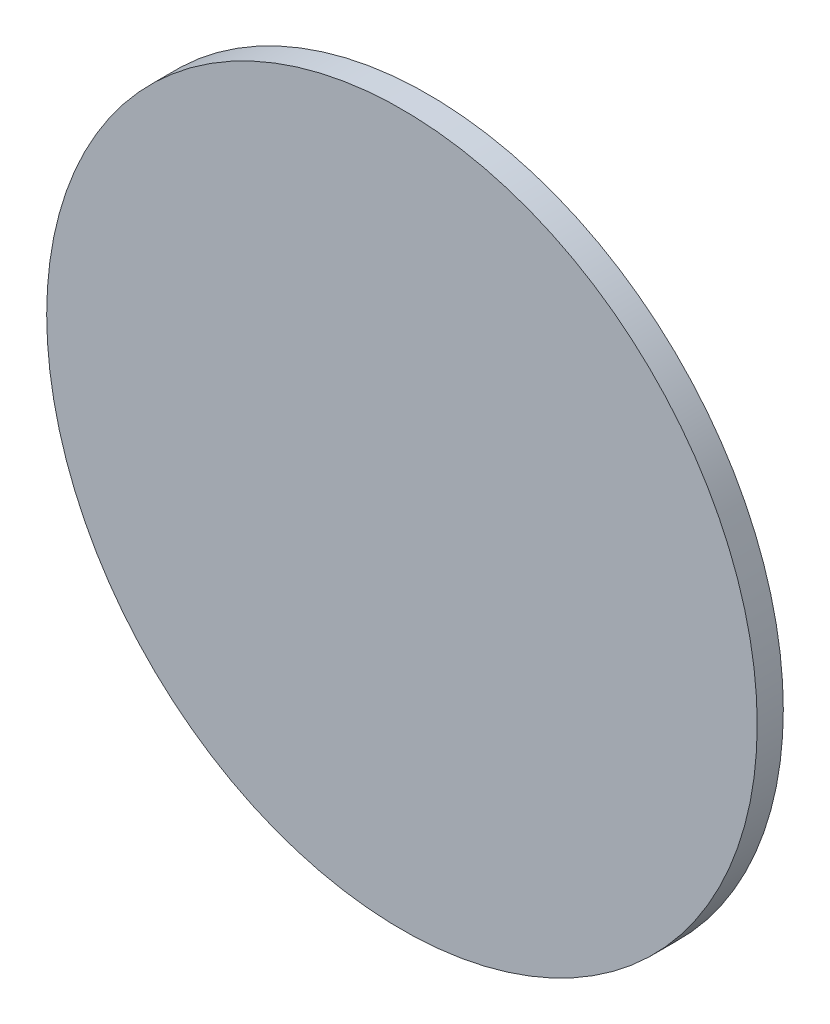
ISO-10303-21;
HEADER;
FILE_DESCRIPTION(('STEP AP214'),'2;1');
FILE_NAME('part.step','',(''),(''),'','','');
FILE_SCHEMA(('AUTOMOTIVE_DESIGN { 1 0 10303 214 1 1 1 1 }'));
ENDSEC;
DATA;
#1=APPLICATION_CONTEXT('core data for automotive mechanical design processes');
#2=APPLICATION_PROTOCOL_DEFINITION('international standard','automotive_design',2000,#1);
#3=PRODUCT_CONTEXT('',#1,'mechanical');
#4=PRODUCT('Part','Part','',(#3));
#5=PRODUCT_RELATED_PRODUCT_CATEGORY('part','',(#4));
#6=PRODUCT_DEFINITION_FORMATION('','',#4);
#7=PRODUCT_DEFINITION_CONTEXT('part definition',#1,'design');
#8=PRODUCT_DEFINITION('design','',#6,#7);
#9=PRODUCT_DEFINITION_SHAPE('','',#8);
#10=(LENGTH_UNIT() NAMED_UNIT(*) SI_UNIT(.MILLI.,.METRE.));
#11=(NAMED_UNIT(*) PLANE_ANGLE_UNIT() SI_UNIT($,.RADIAN.));
#12=(NAMED_UNIT(*) SI_UNIT($,.STERADIAN.) SOLID_ANGLE_UNIT());
#13=UNCERTAINTY_MEASURE_WITH_UNIT(LENGTH_MEASURE(1.E-05),#10,'distance_accuracy_value','');
#14=(GEOMETRIC_REPRESENTATION_CONTEXT(3) GLOBAL_UNCERTAINTY_ASSIGNED_CONTEXT((#13)) GLOBAL_UNIT_ASSIGNED_CONTEXT((#10,
#11,#12)) REPRESENTATION_CONTEXT('',''));
#15=CARTESIAN_POINT('',(0.,0.,0.));
#16=DIRECTION('',(0.,0.,1.));
#17=DIRECTION('',(1.,0.,0.));
#18=AXIS2_PLACEMENT_3D('',#15,#16,#17);
#19=CARTESIAN_POINT('',(-114.963536702248,311.58839238709,2.));
#20=DIRECTION('',(0.,0.,-1.));
#21=DIRECTION('',(-1.,0.,0.));
#22=AXIS2_PLACEMENT_3D('',#19,#20,#21);
#23=CYLINDRICAL_SURFACE('',#22,27.2331992043407);
#24=CARTESIAN_POINT('',(-114.963536702248,311.58839238709,2.));
#25=DIRECTION('',(0.,0.,1.));
#26=DIRECTION('',(1.,0.,0.));
#27=AXIS2_PLACEMENT_3D('',#24,#25,#26);
#28=CIRCLE('',#27,27.2331992043407);
#29=CARTESIAN_POINT('',(-87.7303374979076,311.58839238709,2.));
#30=VERTEX_POINT('',#29);
#31=EDGE_CURVE('E10',#30,#30,#28,.T.);
#32=ORIENTED_EDGE('',*,*,#31,.F.);
#33=EDGE_LOOP('',(#32));
#34=FACE_BOUND('',#33,.T.);
#35=CARTESIAN_POINT('',(-114.963536702248,311.58839238709,0.));
#36=DIRECTION('',(0.,0.,1.));
#37=DIRECTION('',(1.,0.,0.));
#38=AXIS2_PLACEMENT_3D('',#35,#36,#37);
#39=CIRCLE('',#38,27.2331992043407);
#40=CARTESIAN_POINT('',(-87.7303374979076,311.58839238709,0.));
#41=VERTEX_POINT('',#40);
#42=EDGE_CURVE('E38',#41,#41,#39,.T.);
#43=ORIENTED_EDGE('',*,*,#42,.T.);
#44=EDGE_LOOP('',(#43));
#45=FACE_BOUND('',#44,.T.);
#46=ADVANCED_FACE('F35',(#34,#45),#23,.T.);
#47=CARTESIAN_POINT('',(-114.963536702248,311.58839238709,2.));
#48=DIRECTION('',(0.,0.,1.));
#49=DIRECTION('',(1.,0.,0.));
#50=AXIS2_PLACEMENT_3D('',#47,#48,#49);
#51=PLANE('',#50);
#52=ORIENTED_EDGE('',*,*,#31,.T.);
#53=EDGE_LOOP('',(#52));
#54=FACE_BOUND('',#53,.T.);
#55=ADVANCED_FACE('F50',(#54),#51,.T.);
#56=CARTESIAN_POINT('',(-114.963536702248,311.58839238709,0.));
#57=DIRECTION('',(0.,0.,1.));
#58=DIRECTION('',(1.,0.,0.));
#59=AXIS2_PLACEMENT_3D('',#56,#57,#58);
#60=PLANE('',#59);
#61=ORIENTED_EDGE('',*,*,#42,.F.);
#62=EDGE_LOOP('',(#61));
#63=FACE_BOUND('',#62,.T.);
#64=ADVANCED_FACE('F48',(#63),#60,.F.);
#65=CLOSED_SHELL('',(#46,#55,#64));
#66=MANIFOLD_SOLID_BREP('B2',#65);
#67=ADVANCED_BREP_SHAPE_REPRESENTATION('',(#18,#66),#14);
#68=SHAPE_DEFINITION_REPRESENTATION(#9,#67);
ENDSEC;
END-ISO-10303-21;
